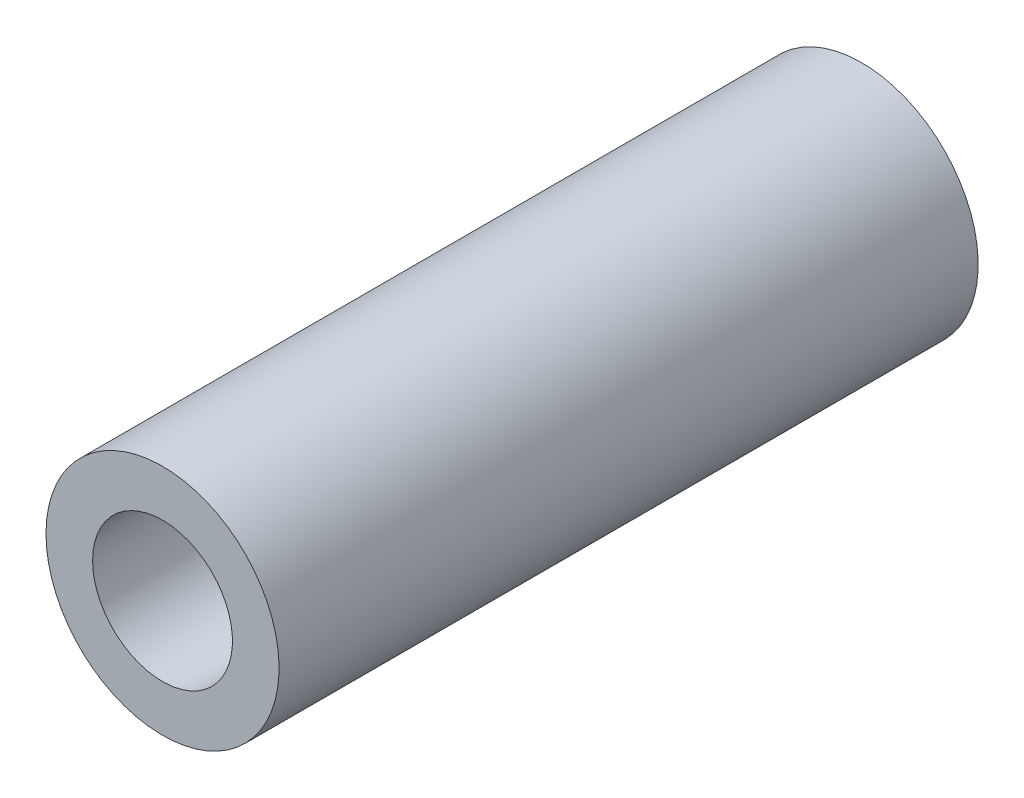
ISO-10303-21;
HEADER;
FILE_DESCRIPTION(('STEP AP214'),'2;1');
FILE_NAME('part.step','',(''),(''),'','','');
FILE_SCHEMA(('AUTOMOTIVE_DESIGN { 1 0 10303 214 1 1 1 1 }'));
ENDSEC;
DATA;
#1=APPLICATION_CONTEXT('core data for automotive mechanical design processes');
#2=APPLICATION_PROTOCOL_DEFINITION('international standard','automotive_design',2000,#1);
#3=PRODUCT_CONTEXT('',#1,'mechanical');
#4=PRODUCT('Part','Part','',(#3));
#5=PRODUCT_RELATED_PRODUCT_CATEGORY('part','',(#4));
#6=PRODUCT_DEFINITION_FORMATION('','',#4);
#7=PRODUCT_DEFINITION_CONTEXT('part definition',#1,'design');
#8=PRODUCT_DEFINITION('design','',#6,#7);
#9=PRODUCT_DEFINITION_SHAPE('','',#8);
#10=(LENGTH_UNIT() NAMED_UNIT(*) SI_UNIT(.MILLI.,.METRE.));
#11=(NAMED_UNIT(*) PLANE_ANGLE_UNIT() SI_UNIT($,.RADIAN.));
#12=(NAMED_UNIT(*) SI_UNIT($,.STERADIAN.) SOLID_ANGLE_UNIT());
#13=UNCERTAINTY_MEASURE_WITH_UNIT(LENGTH_MEASURE(1.E-05),#10,'distance_accuracy_value','');
#14=(GEOMETRIC_REPRESENTATION_CONTEXT(3) GLOBAL_UNCERTAINTY_ASSIGNED_CONTEXT((#13)) GLOBAL_UNIT_ASSIGNED_CONTEXT((#10,
#11,#12)) REPRESENTATION_CONTEXT('',''));
#15=CARTESIAN_POINT('',(0.,0.,0.));
#16=DIRECTION('',(0.,0.,1.));
#17=DIRECTION('',(1.,0.,0.));
#18=AXIS2_PLACEMENT_3D('',#15,#16,#17);
#19=CARTESIAN_POINT('',(0.,0.,22.5));
#20=DIRECTION('',(0.,0.,1.));
#21=DIRECTION('',(1.,0.,0.));
#22=AXIS2_PLACEMENT_3D('',#19,#20,#21);
#23=PLANE('',#22);
#24=CARTESIAN_POINT('',(0.,0.,22.5));
#25=DIRECTION('',(0.,0.,1.));
#26=DIRECTION('',(1.,0.,0.));
#27=AXIS2_PLACEMENT_3D('',#24,#25,#26);
#28=CIRCLE('',#27,7.5);
#29=CARTESIAN_POINT('',(-7.5,0.,22.5));
#30=VERTEX_POINT('',#29);
#31=EDGE_CURVE('E10',#30,#30,#28,.T.);
#32=ORIENTED_EDGE('',*,*,#31,.T.);
#33=EDGE_LOOP('',(#32));
#34=FACE_BOUND('',#33,.T.);
#35=CARTESIAN_POINT('',(0.,0.,22.5));
#36=DIRECTION('',(0.,0.,1.));
#37=DIRECTION('',(1.,0.,0.));
#38=AXIS2_PLACEMENT_3D('',#35,#36,#37);
#39=CIRCLE('',#38,4.5);
#40=CARTESIAN_POINT('',(-4.5,0.,22.5));
#41=VERTEX_POINT('',#40);
#42=EDGE_CURVE('E50',#41,#41,#39,.T.);
#43=ORIENTED_EDGE('',*,*,#42,.F.);
#44=EDGE_LOOP('',(#43));
#45=FACE_BOUND('',#44,.T.);
#46=ADVANCED_FACE('F37',(#34,#45),#23,.T.);
#47=CARTESIAN_POINT('',(0.,0.,-22.5));
#48=DIRECTION('',(0.,0.,1.));
#49=DIRECTION('',(1.,0.,0.));
#50=AXIS2_PLACEMENT_3D('',#47,#48,#49);
#51=PLANE('',#50);
#52=CARTESIAN_POINT('',(0.,0.,-22.5));
#53=DIRECTION('',(0.,0.,1.));
#54=DIRECTION('',(1.,0.,0.));
#55=AXIS2_PLACEMENT_3D('',#52,#53,#54);
#56=CIRCLE('',#55,7.5);
#57=CARTESIAN_POINT('',(-7.5,0.,-22.5));
#58=VERTEX_POINT('',#57);
#59=EDGE_CURVE('E41',#58,#58,#56,.T.);
#60=ORIENTED_EDGE('',*,*,#59,.F.);
#61=EDGE_LOOP('',(#60));
#62=FACE_BOUND('',#61,.T.);
#63=CARTESIAN_POINT('',(0.,0.,-22.5));
#64=DIRECTION('',(0.,0.,1.));
#65=DIRECTION('',(1.,0.,0.));
#66=AXIS2_PLACEMENT_3D('',#63,#64,#65);
#67=CIRCLE('',#66,4.5);
#68=CARTESIAN_POINT('',(-4.5,0.,-22.5));
#69=VERTEX_POINT('',#68);
#70=EDGE_CURVE('E52',#69,#69,#67,.T.);
#71=ORIENTED_EDGE('',*,*,#70,.T.);
#72=EDGE_LOOP('',(#71));
#73=FACE_BOUND('',#72,.T.);
#74=ADVANCED_FACE('F64',(#62,#73),#51,.F.);
#75=CARTESIAN_POINT('',(0.,0.,22.5));
#76=DIRECTION('',(0.,0.,-1.));
#77=DIRECTION('',(-1.,0.,0.));
#78=AXIS2_PLACEMENT_3D('',#75,#76,#77);
#79=CYLINDRICAL_SURFACE('',#78,7.5);
#80=CARTESIAN_POINT('',(-7.5,0.,22.5));
#81=CARTESIAN_POINT('',(-7.5,0.,22.03125));
#82=CARTESIAN_POINT('',(-7.5,0.,21.5625));
#83=CARTESIAN_POINT('',(-7.5,0.,20.625));
#84=CARTESIAN_POINT('',(-7.5,0.,20.15625));
#85=CARTESIAN_POINT('',(-7.5,0.,19.21875));
#86=CARTESIAN_POINT('',(-7.5,0.,18.75));
#87=CARTESIAN_POINT('',(-7.5,0.,17.8125));
#88=CARTESIAN_POINT('',(-7.5,0.,17.34375));
#89=CARTESIAN_POINT('',(-7.5,0.,16.40625));
#90=CARTESIAN_POINT('',(-7.5,0.,15.9375));
#91=CARTESIAN_POINT('',(-7.5,0.,15.));
#92=CARTESIAN_POINT('',(-7.5,0.,14.53125));
#93=CARTESIAN_POINT('',(-7.5,0.,13.59375));
#94=CARTESIAN_POINT('',(-7.5,0.,13.125));
#95=CARTESIAN_POINT('',(-7.5,0.,12.1875));
#96=CARTESIAN_POINT('',(-7.5,0.,11.71875));
#97=CARTESIAN_POINT('',(-7.5,0.,10.78125));
#98=CARTESIAN_POINT('',(-7.5,0.,10.3125));
#99=CARTESIAN_POINT('',(-7.5,0.,9.37499999999999));
#100=CARTESIAN_POINT('',(-7.5,0.,8.90625));
#101=CARTESIAN_POINT('',(-7.5,0.,7.96874999999999));
#102=CARTESIAN_POINT('',(-7.5,0.,7.5));
#103=CARTESIAN_POINT('',(-7.5,0.,6.5625));
#104=CARTESIAN_POINT('',(-7.5,0.,6.09374999999999));
#105=CARTESIAN_POINT('',(-7.5,0.,5.15624999999999));
#106=CARTESIAN_POINT('',(-7.5,0.,4.68749999999999));
#107=CARTESIAN_POINT('',(-7.5,0.,3.74999999999999));
#108=CARTESIAN_POINT('',(-7.5,0.,3.28124999999999));
#109=CARTESIAN_POINT('',(-7.5,0.,2.34375));
#110=CARTESIAN_POINT('',(-7.5,0.,1.87499999999999));
#111=CARTESIAN_POINT('',(-7.5,0.,0.937499999999994));
#112=CARTESIAN_POINT('',(-7.5,0.,0.468749999999993));
#113=CARTESIAN_POINT('',(-7.5,0.,-0.468750000000007));
#114=CARTESIAN_POINT('',(-7.5,0.,-0.937500000000008));
#115=CARTESIAN_POINT('',(-7.5,0.,-1.87500000000001));
#116=CARTESIAN_POINT('',(-7.5,0.,-2.34375000000001));
#117=CARTESIAN_POINT('',(-7.5,0.,-3.28125000000001));
#118=CARTESIAN_POINT('',(-7.5,0.,-3.75000000000001));
#119=CARTESIAN_POINT('',(-7.5,0.,-4.68750000000001));
#120=CARTESIAN_POINT('',(-7.5,0.,-5.15625000000001));
#121=CARTESIAN_POINT('',(-7.5,0.,-6.09375000000001));
#122=CARTESIAN_POINT('',(-7.5,0.,-6.56250000000001));
#123=CARTESIAN_POINT('',(-7.5,0.,-7.50000000000001));
#124=CARTESIAN_POINT('',(-7.5,0.,-7.96875000000001));
#125=CARTESIAN_POINT('',(-7.5,0.,-8.90625000000001));
#126=CARTESIAN_POINT('',(-7.5,0.,-9.37500000000001));
#127=CARTESIAN_POINT('',(-7.5,0.,-10.3125));
#128=CARTESIAN_POINT('',(-7.5,0.,-10.78125));
#129=CARTESIAN_POINT('',(-7.5,0.,-11.71875));
#130=CARTESIAN_POINT('',(-7.5,0.,-12.1875));
#131=CARTESIAN_POINT('',(-7.5,0.,-13.125));
#132=CARTESIAN_POINT('',(-7.5,0.,-13.59375));
#133=CARTESIAN_POINT('',(-7.5,0.,-14.53125));
#134=CARTESIAN_POINT('',(-7.5,0.,-15.));
#135=CARTESIAN_POINT('',(-7.5,0.,-15.9375));
#136=CARTESIAN_POINT('',(-7.5,0.,-16.40625));
#137=CARTESIAN_POINT('',(-7.5,0.,-17.34375));
#138=CARTESIAN_POINT('',(-7.5,0.,-17.8125));
#139=CARTESIAN_POINT('',(-7.5,0.,-18.75));
#140=CARTESIAN_POINT('',(-7.5,0.,-19.21875));
#141=CARTESIAN_POINT('',(-7.5,0.,-20.15625));
#142=CARTESIAN_POINT('',(-7.5,0.,-20.625));
#143=CARTESIAN_POINT('',(-7.5,0.,-21.5625));
#144=CARTESIAN_POINT('',(-7.5,0.,-22.03125));
#145=CARTESIAN_POINT('',(-7.5,0.,-22.5));
#146=B_SPLINE_CURVE_WITH_KNOTS('',3,(#80,#81,#82,#83,#84,#85,#86,#87,#88,#89,#90,#91,#92,#93,
#94,#95,#96,#97,#98,#99,#100,#101,#102,#103,#104,#105,#106,#107,#108,#109,#110,#111,#112,#113,
#114,#115,#116,#117,#118,#119,#120,#121,#122,#123,#124,#125,#126,#127,#128,#129,#130,#131,#132,
#133,#134,#135,#136,#137,#138,#139,#140,#141,#142,#143,#144,#145),.UNSPECIFIED.,.F.,.F.,(4,2,2,
2,2,2,2,2,2,2,2,2,2,2,2,2,2,2,2,2,2,2,2,2,2,2,2,2,2,2,2,2,4),(0.,1.40625,2.8125,4.21875,5.625,
7.03125,8.4375,9.84375,11.25,12.65625,14.0625,15.46875,16.875,18.28125,19.6875,21.09375,22.5,
23.90625,25.3125,26.71875,28.125,29.53125,30.9375,32.34375,33.75,35.15625,36.5625,37.96875,
39.375,40.78125,42.1875,43.59375,45.),.UNSPECIFIED.);
#147=EDGE_CURVE('BSEAM39',#30,#58,#146,.T.);
#148=ORIENTED_EDGE('',*,*,#31,.F.);
#149=ORIENTED_EDGE('',*,*,#59,.T.);
#150=ORIENTED_EDGE('',*,*,#147,.T.);
#151=ORIENTED_EDGE('',*,*,#147,.F.);
#152=EDGE_LOOP('',(#148,#150,#149,#151));
#153=FACE_BOUND('',#152,.T.);
#154=ADVANCED_FACE('F39',(#153),#79,.T.);
#155=CARTESIAN_POINT('',(0.,0.,22.5));
#156=DIRECTION('',(0.,0.,-1.));
#157=DIRECTION('',(-1.,0.,0.));
#158=AXIS2_PLACEMENT_3D('',#155,#156,#157);
#159=CYLINDRICAL_SURFACE('',#158,4.5);
#160=CARTESIAN_POINT('',(-4.5,0.,22.5));
#161=CARTESIAN_POINT('',(-4.5,0.,22.03125));
#162=CARTESIAN_POINT('',(-4.5,0.,21.5625));
#163=CARTESIAN_POINT('',(-4.5,0.,20.625));
#164=CARTESIAN_POINT('',(-4.5,0.,20.15625));
#165=CARTESIAN_POINT('',(-4.5,0.,19.21875));
#166=CARTESIAN_POINT('',(-4.5,0.,18.75));
#167=CARTESIAN_POINT('',(-4.5,0.,17.8125));
#168=CARTESIAN_POINT('',(-4.5,0.,17.34375));
#169=CARTESIAN_POINT('',(-4.5,0.,16.40625));
#170=CARTESIAN_POINT('',(-4.5,0.,15.9375));
#171=CARTESIAN_POINT('',(-4.5,0.,15.));
#172=CARTESIAN_POINT('',(-4.5,0.,14.53125));
#173=CARTESIAN_POINT('',(-4.5,0.,13.59375));
#174=CARTESIAN_POINT('',(-4.5,0.,13.125));
#175=CARTESIAN_POINT('',(-4.5,0.,12.1875));
#176=CARTESIAN_POINT('',(-4.5,0.,11.71875));
#177=CARTESIAN_POINT('',(-4.5,0.,10.78125));
#178=CARTESIAN_POINT('',(-4.5,0.,10.3125));
#179=CARTESIAN_POINT('',(-4.5,0.,9.37499999999999));
#180=CARTESIAN_POINT('',(-4.5,0.,8.90625));
#181=CARTESIAN_POINT('',(-4.5,0.,7.96874999999999));
#182=CARTESIAN_POINT('',(-4.5,0.,7.5));
#183=CARTESIAN_POINT('',(-4.5,0.,6.5625));
#184=CARTESIAN_POINT('',(-4.5,0.,6.09375));
#185=CARTESIAN_POINT('',(-4.5,0.,5.15625));
#186=CARTESIAN_POINT('',(-4.5,0.,4.6875));
#187=CARTESIAN_POINT('',(-4.5,0.,3.75));
#188=CARTESIAN_POINT('',(-4.5,0.,3.28125));
#189=CARTESIAN_POINT('',(-4.5,0.,2.34375));
#190=CARTESIAN_POINT('',(-4.5,0.,1.875));
#191=CARTESIAN_POINT('',(-4.5,0.,0.937499999999997));
#192=CARTESIAN_POINT('',(-4.5,0.,0.468749999999997));
#193=CARTESIAN_POINT('',(-4.5,0.,-0.468750000000004));
#194=CARTESIAN_POINT('',(-4.5,0.,-0.937500000000004));
#195=CARTESIAN_POINT('',(-4.5,0.,-1.87500000000001));
#196=CARTESIAN_POINT('',(-4.5,0.,-2.34375000000001));
#197=CARTESIAN_POINT('',(-4.5,0.,-3.28125));
#198=CARTESIAN_POINT('',(-4.5,0.,-3.75));
#199=CARTESIAN_POINT('',(-4.5,0.,-4.6875));
#200=CARTESIAN_POINT('',(-4.5,0.,-5.15625));
#201=CARTESIAN_POINT('',(-4.5,0.,-6.09375000000001));
#202=CARTESIAN_POINT('',(-4.5,0.,-6.56250000000001));
#203=CARTESIAN_POINT('',(-4.5,0.,-7.50000000000001));
#204=CARTESIAN_POINT('',(-4.5,0.,-7.96875000000001));
#205=CARTESIAN_POINT('',(-4.5,0.,-8.90625));
#206=CARTESIAN_POINT('',(-4.5,0.,-9.37500000000001));
#207=CARTESIAN_POINT('',(-4.5,0.,-10.3125));
#208=CARTESIAN_POINT('',(-4.5,0.,-10.78125));
#209=CARTESIAN_POINT('',(-4.5,0.,-11.71875));
#210=CARTESIAN_POINT('',(-4.5,0.,-12.1875));
#211=CARTESIAN_POINT('',(-4.5,0.,-13.125));
#212=CARTESIAN_POINT('',(-4.5,0.,-13.59375));
#213=CARTESIAN_POINT('',(-4.5,0.,-14.53125));
#214=CARTESIAN_POINT('',(-4.5,0.,-15.));
#215=CARTESIAN_POINT('',(-4.5,0.,-15.9375));
#216=CARTESIAN_POINT('',(-4.5,0.,-16.40625));
#217=CARTESIAN_POINT('',(-4.5,0.,-17.34375));
#218=CARTESIAN_POINT('',(-4.5,0.,-17.8125));
#219=CARTESIAN_POINT('',(-4.5,0.,-18.75));
#220=CARTESIAN_POINT('',(-4.5,0.,-19.21875));
#221=CARTESIAN_POINT('',(-4.5,0.,-20.15625));
#222=CARTESIAN_POINT('',(-4.5,0.,-20.625));
#223=CARTESIAN_POINT('',(-4.5,0.,-21.5625));
#224=CARTESIAN_POINT('',(-4.5,0.,-22.03125));
#225=CARTESIAN_POINT('',(-4.5,0.,-22.5));
#226=B_SPLINE_CURVE_WITH_KNOTS('',3,(#160,#161,#162,#163,#164,#165,#166,#167,#168,#169,#170,
#171,#172,#173,#174,#175,#176,#177,#178,#179,#180,#181,#182,#183,#184,#185,#186,#187,#188,#189,
#190,#191,#192,#193,#194,#195,#196,#197,#198,#199,#200,#201,#202,#203,#204,#205,#206,#207,#208,
#209,#210,#211,#212,#213,#214,#215,#216,#217,#218,#219,#220,#221,#222,#223,#224,#225),
.UNSPECIFIED.,.F.,.F.,(4,2,2,2,2,2,2,2,2,2,2,2,2,2,2,2,2,2,2,2,2,2,2,2,2,2,2,2,2,2,2,2,4),(0.,
1.40625,2.8125,4.21875,5.625,7.03125,8.4375,9.84375,11.25,12.65625,14.0625,15.46875,16.875,
18.28125,19.6875,21.09375,22.5,23.90625,25.3125,26.71875,28.125,29.53125,30.9375,32.34375,33.75,
35.15625,36.5625,37.96875,39.375,40.78125,42.1875,43.59375,45.),.UNSPECIFIED.);
#227=EDGE_CURVE('BSEAM60',#41,#69,#226,.T.);
#228=ORIENTED_EDGE('',*,*,#42,.T.);
#229=ORIENTED_EDGE('',*,*,#70,.F.);
#230=ORIENTED_EDGE('',*,*,#227,.T.);
#231=ORIENTED_EDGE('',*,*,#227,.F.);
#232=EDGE_LOOP('',(#228,#230,#229,#231));
#233=FACE_BOUND('',#232,.T.);
#234=ADVANCED_FACE('F60',(#233),#159,.F.);
#235=CLOSED_SHELL('',(#46,#74,#154,#234));
#236=MANIFOLD_SOLID_BREP('B2',#235);
#237=ADVANCED_BREP_SHAPE_REPRESENTATION('',(#18,#236),#14);
#238=SHAPE_DEFINITION_REPRESENTATION(#9,#237);
ENDSEC;
END-ISO-10303-21;
